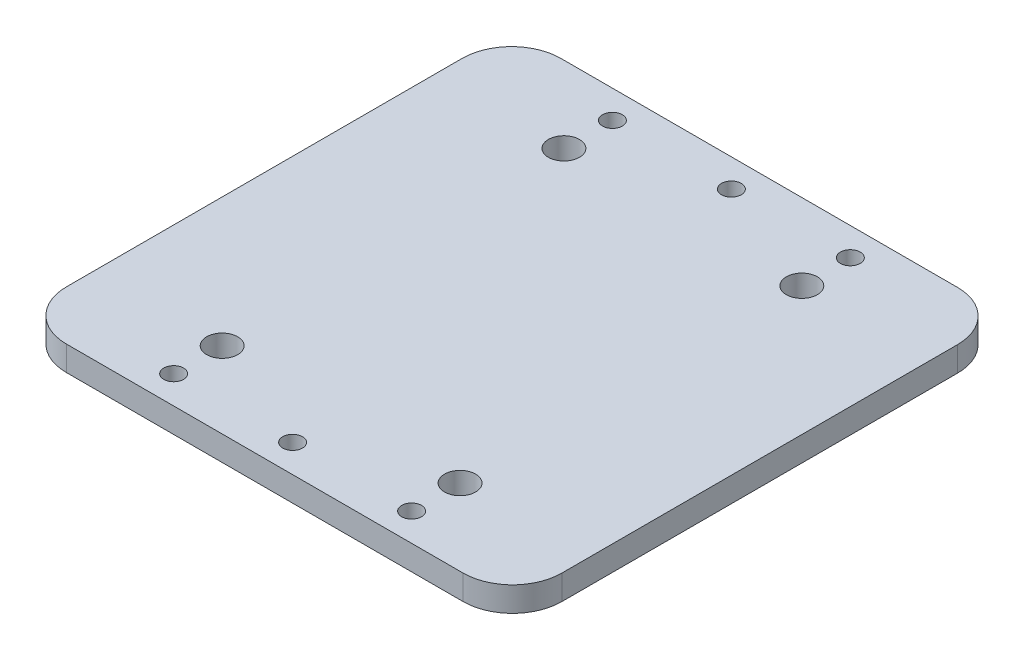
ISO-10303-21;
HEADER;
FILE_DESCRIPTION(('STEP AP214'),'2;1');
FILE_NAME('part.step','',(''),(''),'','','');
FILE_SCHEMA(('AUTOMOTIVE_DESIGN { 1 0 10303 214 1 1 1 1 }'));
ENDSEC;
DATA;
#1=APPLICATION_CONTEXT('core data for automotive mechanical design processes');
#2=APPLICATION_PROTOCOL_DEFINITION('international standard','automotive_design',2000,#1);
#3=PRODUCT_CONTEXT('',#1,'mechanical');
#4=PRODUCT('Part','Part','',(#3));
#5=PRODUCT_RELATED_PRODUCT_CATEGORY('part','',(#4));
#6=PRODUCT_DEFINITION_FORMATION('','',#4);
#7=PRODUCT_DEFINITION_CONTEXT('part definition',#1,'design');
#8=PRODUCT_DEFINITION('design','',#6,#7);
#9=PRODUCT_DEFINITION_SHAPE('','',#8);
#10=(LENGTH_UNIT() NAMED_UNIT(*) SI_UNIT(.MILLI.,.METRE.));
#11=(NAMED_UNIT(*) PLANE_ANGLE_UNIT() SI_UNIT($,.RADIAN.));
#12=(NAMED_UNIT(*) SI_UNIT($,.STERADIAN.) SOLID_ANGLE_UNIT());
#13=UNCERTAINTY_MEASURE_WITH_UNIT(LENGTH_MEASURE(1.E-05),#10,'distance_accuracy_value','');
#14=(GEOMETRIC_REPRESENTATION_CONTEXT(3) GLOBAL_UNCERTAINTY_ASSIGNED_CONTEXT((#13)) GLOBAL_UNIT_ASSIGNED_CONTEXT((#10,
#11,#12)) REPRESENTATION_CONTEXT('',''));
#15=CARTESIAN_POINT('',(0.,0.,0.));
#16=DIRECTION('',(0.,0.,1.));
#17=DIRECTION('',(1.,0.,0.));
#18=AXIS2_PLACEMENT_3D('',#15,#16,#17);
#19=CARTESIAN_POINT('',(0.,5.,0.));
#20=DIRECTION('',(0.,1.,0.));
#21=DIRECTION('',(0.,0.,1.));
#22=AXIS2_PLACEMENT_3D('',#19,#20,#21);
#23=PLANE('',#22);
#24=CARTESIAN_POINT('',(4.40209205020921,5.,23.594960522969));
#25=DIRECTION('',(0.,1.,0.));
#26=DIRECTION('',(0.,0.,-1.));
#27=AXIS2_PLACEMENT_3D('',#24,#25,#26);
#28=CIRCLE('',#27,2.);
#29=CARTESIAN_POINT('',(4.40209205020921,5.,21.594960522969));
#30=VERTEX_POINT('',#29);
#31=EDGE_CURVE('E272',#30,#30,#28,.T.);
#32=ORIENTED_EDGE('',*,*,#31,.F.);
#33=EDGE_LOOP('',(#32));
#34=FACE_BOUND('',#33,.T.);
#35=CARTESIAN_POINT('',(28.4520920502092,5.,-65.1100232844753));
#36=DIRECTION('',(0.,1.,0.));
#37=DIRECTION('',(0.,0.,1.));
#38=AXIS2_PLACEMENT_3D('',#35,#36,#37);
#39=CIRCLE('',#38,2.);
#40=CARTESIAN_POINT('',(28.4520920502092,5.,-63.1100232844753));
#41=VERTEX_POINT('',#40);
#42=EDGE_CURVE('E256',#41,#41,#39,.T.);
#43=ORIENTED_EDGE('',*,*,#42,.F.);
#44=EDGE_LOOP('',(#43));
#45=FACE_BOUND('',#44,.T.);
#46=CARTESIAN_POINT('',(-19.6479079497901,5.,13.7924686192469));
#47=DIRECTION('',(0.,1.,0.));
#48=DIRECTION('',(0.,0.,1.));
#49=AXIS2_PLACEMENT_3D('',#46,#47,#48);
#50=CIRCLE('',#49,3.14);
#51=CARTESIAN_POINT('',(-19.6479079497901,5.,16.9324686192469));
#52=VERTEX_POINT('',#51);
#53=EDGE_CURVE('E240',#52,#52,#50,.T.);
#54=ORIENTED_EDGE('',*,*,#53,.F.);
#55=EDGE_LOOP('',(#54));
#56=FACE_BOUND('',#55,.T.);
#57=CARTESIAN_POINT('',(28.4520920502092,5.,-55.3075313807531));
#58=DIRECTION('',(0.,1.,0.));
#59=DIRECTION('',(0.,0.,1.));
#60=AXIS2_PLACEMENT_3D('',#57,#58,#59);
#61=CIRCLE('',#60,3.14);
#62=CARTESIAN_POINT('',(28.4520920502092,5.,-52.1675313807531));
#63=VERTEX_POINT('',#62);
#64=EDGE_CURVE('E224',#63,#63,#61,.T.);
#65=ORIENTED_EDGE('',*,*,#64,.F.);
#66=EDGE_LOOP('',(#65));
#67=FACE_BOUND('',#66,.T.);
#68=CARTESIAN_POINT('',(-19.6479079497908,5.,-55.3075313807531));
#69=DIRECTION('',(0.,1.,0.));
#70=DIRECTION('',(0.,0.,1.));
#71=AXIS2_PLACEMENT_3D('',#68,#69,#70);
#72=CIRCLE('',#71,3.14);
#73=CARTESIAN_POINT('',(-19.6479079497908,5.,-52.1675313807531));
#74=VERTEX_POINT('',#73);
#75=EDGE_CURVE('E139',#74,#74,#72,.T.);
#76=ORIENTED_EDGE('',*,*,#75,.F.);
#77=EDGE_LOOP('',(#76));
#78=FACE_BOUND('',#77,.T.);
#79=DIRECTION('',(-1.,0.,0.));
#80=VECTOR('',#79,1.);
#81=CARTESIAN_POINT('',(-45.6979079497908,5.,-70.7575313807531));
#82=LINE('',#81,#80);
#83=CARTESIAN_POINT('',(44.5020920502092,5.,-70.7575313807531));
#84=VERTEX_POINT('',#83);
#85=CARTESIAN_POINT('',(-35.6979079497908,5.,-70.7575313807531));
#86=VERTEX_POINT('',#85);
#87=EDGE_CURVE('E150',#84,#86,#82,.T.);
#88=ORIENTED_EDGE('',*,*,#87,.T.);
#89=CARTESIAN_POINT('',(-35.6979079497908,5.,-60.7575313807531));
#90=DIRECTION('',(0.,1.,0.));
#91=DIRECTION('',(0.,0.,1.));
#92=AXIS2_PLACEMENT_3D('',#89,#90,#91);
#93=CIRCLE('',#92,10.);
#94=CARTESIAN_POINT('',(-45.6979079497908,5.,-60.7575313807531));
#95=VERTEX_POINT('',#94);
#96=EDGE_CURVE('E179',#86,#95,#93,.T.);
#97=ORIENTED_EDGE('',*,*,#96,.T.);
#98=DIRECTION('',(0.,0.,1.));
#99=VECTOR('',#98,1.);
#100=CARTESIAN_POINT('',(-45.6979079497908,5.,-70.7575313807531));
#101=LINE('',#100,#99);
#102=CARTESIAN_POINT('',(-45.6979079497908,5.,19.2424686192469));
#103=VERTEX_POINT('',#102);
#104=EDGE_CURVE('E128',#95,#103,#101,.T.);
#105=ORIENTED_EDGE('',*,*,#104,.T.);
#106=CARTESIAN_POINT('',(-35.6979079497908,5.,19.2424686192469));
#107=DIRECTION('',(0.,1.,0.));
#108=DIRECTION('',(0.,0.,1.));
#109=AXIS2_PLACEMENT_3D('',#106,#107,#108);
#110=CIRCLE('',#109,10.);
#111=CARTESIAN_POINT('',(-35.6979079497908,5.,29.2424686192469));
#112=VERTEX_POINT('',#111);
#113=EDGE_CURVE('E173',#103,#112,#110,.T.);
#114=ORIENTED_EDGE('',*,*,#113,.T.);
#115=DIRECTION('',(1.,0.,0.));
#116=VECTOR('',#115,1.);
#117=CARTESIAN_POINT('',(-45.6979079497908,5.,29.2424686192469));
#118=LINE('',#117,#116);
#119=CARTESIAN_POINT('',(44.5020920502092,5.,29.2424686192469));
#120=VERTEX_POINT('',#119);
#121=EDGE_CURVE('E192',#112,#120,#118,.T.);
#122=ORIENTED_EDGE('',*,*,#121,.T.);
#123=CARTESIAN_POINT('',(44.5020920502092,5.,19.2424686192469));
#124=DIRECTION('',(0.,1.,0.));
#125=DIRECTION('',(0.,0.,1.));
#126=AXIS2_PLACEMENT_3D('',#123,#124,#125);
#127=CIRCLE('',#126,10.);
#128=CARTESIAN_POINT('',(54.5020920502092,5.,19.2424686192469));
#129=VERTEX_POINT('',#128);
#130=EDGE_CURVE('E62',#120,#129,#127,.T.);
#131=ORIENTED_EDGE('',*,*,#130,.T.);
#132=DIRECTION('',(0.,0.,-1.));
#133=VECTOR('',#132,1.);
#134=CARTESIAN_POINT('',(54.5020920502092,5.,-70.7575313807531));
#135=LINE('',#134,#133);
#136=CARTESIAN_POINT('',(54.5020920502092,5.,-60.7575313807531));
#137=VERTEX_POINT('',#136);
#138=EDGE_CURVE('E199',#129,#137,#135,.T.);
#139=ORIENTED_EDGE('',*,*,#138,.T.);
#140=CARTESIAN_POINT('',(44.5020920502092,5.,-60.7575313807531));
#141=DIRECTION('',(0.,1.,0.));
#142=DIRECTION('',(0.,0.,1.));
#143=AXIS2_PLACEMENT_3D('',#140,#141,#142);
#144=CIRCLE('',#143,10.);
#145=EDGE_CURVE('E176',#137,#84,#144,.T.);
#146=ORIENTED_EDGE('',*,*,#145,.T.);
#147=EDGE_LOOP('',(#88,#97,#105,#114,#122,#131,#139,#146));
#148=FACE_BOUND('',#147,.T.);
#149=CARTESIAN_POINT('',(-19.6479079497908,5.,-65.1100232844753));
#150=DIRECTION('',(0.,1.,0.));
#151=DIRECTION('',(0.,0.,1.));
#152=AXIS2_PLACEMENT_3D('',#149,#150,#151);
#153=CIRCLE('',#152,2.);
#154=CARTESIAN_POINT('',(-19.6479079497908,5.,-63.1100232844753));
#155=VERTEX_POINT('',#154);
#156=EDGE_CURVE('E218',#155,#155,#153,.T.);
#157=ORIENTED_EDGE('',*,*,#156,.F.);
#158=EDGE_LOOP('',(#157));
#159=FACE_BOUND('',#158,.T.);
#160=CARTESIAN_POINT('',(28.4520920502099,5.,13.7924686192469));
#161=DIRECTION('',(0.,1.,0.));
#162=DIRECTION('',(0.,0.,1.));
#163=AXIS2_PLACEMENT_3D('',#160,#161,#162);
#164=CIRCLE('',#163,3.14);
#165=CARTESIAN_POINT('',(28.4520920502099,5.,16.9324686192469));
#166=VERTEX_POINT('',#165);
#167=EDGE_CURVE('E232',#166,#166,#164,.T.);
#168=ORIENTED_EDGE('',*,*,#167,.F.);
#169=EDGE_LOOP('',(#168));
#170=FACE_BOUND('',#169,.T.);
#171=CARTESIAN_POINT('',(4.40209205020921,5.,-65.1100232844753));
#172=DIRECTION('',(0.,1.,0.));
#173=DIRECTION('',(0.,0.,1.));
#174=AXIS2_PLACEMENT_3D('',#171,#172,#173);
#175=CIRCLE('',#174,2.);
#176=CARTESIAN_POINT('',(4.40209205020921,5.,-63.1100232844753));
#177=VERTEX_POINT('',#176);
#178=EDGE_CURVE('E248',#177,#177,#175,.T.);
#179=ORIENTED_EDGE('',*,*,#178,.F.);
#180=EDGE_LOOP('',(#179));
#181=FACE_BOUND('',#180,.T.);
#182=CARTESIAN_POINT('',(28.4520920502092,5.,23.594960522969));
#183=DIRECTION('',(0.,1.,0.));
#184=DIRECTION('',(0.,0.,-1.));
#185=AXIS2_PLACEMENT_3D('',#182,#183,#184);
#186=CIRCLE('',#185,2.);
#187=CARTESIAN_POINT('',(28.4520920502092,5.,21.594960522969));
#188=VERTEX_POINT('',#187);
#189=EDGE_CURVE('E264',#188,#188,#186,.T.);
#190=ORIENTED_EDGE('',*,*,#189,.F.);
#191=EDGE_LOOP('',(#190));
#192=FACE_BOUND('',#191,.T.);
#193=CARTESIAN_POINT('',(-19.6479079497908,5.,23.594960522969));
#194=DIRECTION('',(0.,1.,0.));
#195=DIRECTION('',(0.,0.,-1.));
#196=AXIS2_PLACEMENT_3D('',#193,#194,#195);
#197=CIRCLE('',#196,2.);
#198=CARTESIAN_POINT('',(-19.6479079497908,5.,21.594960522969));
#199=VERTEX_POINT('',#198);
#200=EDGE_CURVE('E280',#199,#199,#197,.T.);
#201=ORIENTED_EDGE('',*,*,#200,.F.);
#202=EDGE_LOOP('',(#201));
#203=FACE_BOUND('',#202,.T.);
#204=ADVANCED_FACE('F39',(#34,#45,#56,#67,#78,#148,#159,#170,#181,#192,#203),#23,.T.);
#205=CARTESIAN_POINT('',(0.,0.,0.));
#206=DIRECTION('',(0.,1.,0.));
#207=DIRECTION('',(0.,0.,1.));
#208=AXIS2_PLACEMENT_3D('',#205,#206,#207);
#209=PLANE('',#208);
#210=DIRECTION('',(0.,0.,1.));
#211=VECTOR('',#210,1.);
#212=CARTESIAN_POINT('',(-45.6979079497908,0.,-70.7575313807531));
#213=LINE('',#212,#211);
#214=CARTESIAN_POINT('',(-45.6979079497908,0.,-60.7575313807531));
#215=VERTEX_POINT('',#214);
#216=CARTESIAN_POINT('',(-45.6979079497908,0.,19.2424686192469));
#217=VERTEX_POINT('',#216);
#218=EDGE_CURVE('E125',#215,#217,#213,.T.);
#219=ORIENTED_EDGE('',*,*,#218,.F.);
#220=CARTESIAN_POINT('',(-35.6979079497908,0.,-60.7575313807531));
#221=DIRECTION('',(0.,1.,0.));
#222=DIRECTION('',(0.,0.,1.));
#223=AXIS2_PLACEMENT_3D('',#220,#221,#222);
#224=CIRCLE('',#223,10.);
#225=CARTESIAN_POINT('',(-35.6979079497908,0.,-70.7575313807531));
#226=VERTEX_POINT('',#225);
#227=EDGE_CURVE('E107',#215,#226,#224,.F.);
#228=ORIENTED_EDGE('',*,*,#227,.T.);
#229=DIRECTION('',(-1.,0.,0.));
#230=VECTOR('',#229,1.);
#231=CARTESIAN_POINT('',(-45.6979079497908,0.,-70.7575313807531));
#232=LINE('',#231,#230);
#233=CARTESIAN_POINT('',(44.5020920502092,0.,-70.7575313807531));
#234=VERTEX_POINT('',#233);
#235=EDGE_CURVE('E155',#234,#226,#232,.T.);
#236=ORIENTED_EDGE('',*,*,#235,.F.);
#237=CARTESIAN_POINT('',(44.5020920502092,0.,-60.7575313807531));
#238=DIRECTION('',(0.,1.,0.));
#239=DIRECTION('',(0.,0.,1.));
#240=AXIS2_PLACEMENT_3D('',#237,#238,#239);
#241=CIRCLE('',#240,10.);
#242=CARTESIAN_POINT('',(54.5020920502092,0.,-60.7575313807531));
#243=VERTEX_POINT('',#242);
#244=EDGE_CURVE('E119',#234,#243,#241,.F.);
#245=ORIENTED_EDGE('',*,*,#244,.T.);
#246=DIRECTION('',(0.,0.,-1.));
#247=VECTOR('',#246,1.);
#248=CARTESIAN_POINT('',(54.5020920502092,0.,-70.7575313807531));
#249=LINE('',#248,#247);
#250=CARTESIAN_POINT('',(54.5020920502092,0.,19.2424686192469));
#251=VERTEX_POINT('',#250);
#252=EDGE_CURVE('E144',#251,#243,#249,.T.);
#253=ORIENTED_EDGE('',*,*,#252,.F.);
#254=CARTESIAN_POINT('',(44.5020920502092,0.,19.2424686192469));
#255=DIRECTION('',(0.,1.,0.));
#256=DIRECTION('',(0.,0.,1.));
#257=AXIS2_PLACEMENT_3D('',#254,#255,#256);
#258=CIRCLE('',#257,10.);
#259=CARTESIAN_POINT('',(44.5020920502092,0.,29.2424686192469));
#260=VERTEX_POINT('',#259);
#261=EDGE_CURVE('E130',#251,#260,#258,.F.);
#262=ORIENTED_EDGE('',*,*,#261,.T.);
#263=DIRECTION('',(1.,0.,0.));
#264=VECTOR('',#263,1.);
#265=CARTESIAN_POINT('',(-45.6979079497908,0.,29.2424686192469));
#266=LINE('',#265,#264);
#267=CARTESIAN_POINT('',(-35.6979079497908,0.,29.2424686192469));
#268=VERTEX_POINT('',#267);
#269=EDGE_CURVE('E138',#268,#260,#266,.T.);
#270=ORIENTED_EDGE('',*,*,#269,.F.);
#271=CARTESIAN_POINT('',(-35.6979079497908,0.,19.2424686192469));
#272=DIRECTION('',(0.,1.,0.));
#273=DIRECTION('',(0.,0.,1.));
#274=AXIS2_PLACEMENT_3D('',#271,#272,#273);
#275=CIRCLE('',#274,10.);
#276=EDGE_CURVE('E136',#268,#217,#275,.F.);
#277=ORIENTED_EDGE('',*,*,#276,.T.);
#278=EDGE_LOOP('',(#219,#228,#236,#245,#253,#262,#270,#277));
#279=FACE_BOUND('',#278,.T.);
#280=CARTESIAN_POINT('',(-19.6479079497908,0.,-55.3075313807531));
#281=DIRECTION('',(0.,1.,0.));
#282=DIRECTION('',(0.,0.,1.));
#283=AXIS2_PLACEMENT_3D('',#280,#281,#282);
#284=CIRCLE('',#283,3.14);
#285=CARTESIAN_POINT('',(-19.6479079497908,0.,-52.1675313807531));
#286=VERTEX_POINT('',#285);
#287=EDGE_CURVE('E147',#286,#286,#284,.T.);
#288=ORIENTED_EDGE('',*,*,#287,.T.);
#289=EDGE_LOOP('',(#288));
#290=FACE_BOUND('',#289,.T.);
#291=CARTESIAN_POINT('',(-19.6479079497908,0.,-65.1100232844753));
#292=DIRECTION('',(0.,1.,0.));
#293=DIRECTION('',(0.,0.,1.));
#294=AXIS2_PLACEMENT_3D('',#291,#292,#293);
#295=CIRCLE('',#294,2.);
#296=CARTESIAN_POINT('',(-19.6479079497908,0.,-63.1100232844753));
#297=VERTEX_POINT('',#296);
#298=EDGE_CURVE('E220',#297,#297,#295,.T.);
#299=ORIENTED_EDGE('',*,*,#298,.T.);
#300=EDGE_LOOP('',(#299));
#301=FACE_BOUND('',#300,.T.);
#302=CARTESIAN_POINT('',(28.4520920502092,0.,-55.3075313807531));
#303=DIRECTION('',(0.,1.,0.));
#304=DIRECTION('',(0.,0.,1.));
#305=AXIS2_PLACEMENT_3D('',#302,#303,#304);
#306=CIRCLE('',#305,3.14);
#307=CARTESIAN_POINT('',(28.4520920502092,0.,-52.1675313807531));
#308=VERTEX_POINT('',#307);
#309=EDGE_CURVE('E228',#308,#308,#306,.T.);
#310=ORIENTED_EDGE('',*,*,#309,.T.);
#311=EDGE_LOOP('',(#310));
#312=FACE_BOUND('',#311,.T.);
#313=CARTESIAN_POINT('',(28.4520920502099,0.,13.7924686192469));
#314=DIRECTION('',(0.,1.,0.));
#315=DIRECTION('',(0.,0.,1.));
#316=AXIS2_PLACEMENT_3D('',#313,#314,#315);
#317=CIRCLE('',#316,3.14);
#318=CARTESIAN_POINT('',(28.4520920502099,0.,16.9324686192469));
#319=VERTEX_POINT('',#318);
#320=EDGE_CURVE('E236',#319,#319,#317,.T.);
#321=ORIENTED_EDGE('',*,*,#320,.T.);
#322=EDGE_LOOP('',(#321));
#323=FACE_BOUND('',#322,.T.);
#324=CARTESIAN_POINT('',(-19.6479079497901,0.,13.7924686192469));
#325=DIRECTION('',(0.,1.,0.));
#326=DIRECTION('',(0.,0.,1.));
#327=AXIS2_PLACEMENT_3D('',#324,#325,#326);
#328=CIRCLE('',#327,3.14);
#329=CARTESIAN_POINT('',(-19.6479079497901,0.,16.9324686192469));
#330=VERTEX_POINT('',#329);
#331=EDGE_CURVE('E244',#330,#330,#328,.T.);
#332=ORIENTED_EDGE('',*,*,#331,.T.);
#333=EDGE_LOOP('',(#332));
#334=FACE_BOUND('',#333,.T.);
#335=CARTESIAN_POINT('',(4.40209205020921,0.,-65.1100232844753));
#336=DIRECTION('',(0.,1.,0.));
#337=DIRECTION('',(0.,0.,1.));
#338=AXIS2_PLACEMENT_3D('',#335,#336,#337);
#339=CIRCLE('',#338,2.);
#340=CARTESIAN_POINT('',(4.40209205020921,0.,-63.1100232844753));
#341=VERTEX_POINT('',#340);
#342=EDGE_CURVE('E252',#341,#341,#339,.T.);
#343=ORIENTED_EDGE('',*,*,#342,.T.);
#344=EDGE_LOOP('',(#343));
#345=FACE_BOUND('',#344,.T.);
#346=CARTESIAN_POINT('',(28.4520920502092,0.,-65.1100232844753));
#347=DIRECTION('',(0.,1.,0.));
#348=DIRECTION('',(0.,0.,1.));
#349=AXIS2_PLACEMENT_3D('',#346,#347,#348);
#350=CIRCLE('',#349,2.);
#351=CARTESIAN_POINT('',(28.4520920502092,0.,-63.1100232844753));
#352=VERTEX_POINT('',#351);
#353=EDGE_CURVE('E260',#352,#352,#350,.T.);
#354=ORIENTED_EDGE('',*,*,#353,.T.);
#355=EDGE_LOOP('',(#354));
#356=FACE_BOUND('',#355,.T.);
#357=CARTESIAN_POINT('',(28.4520920502092,0.,23.594960522969));
#358=DIRECTION('',(0.,1.,0.));
#359=DIRECTION('',(0.,0.,-1.));
#360=AXIS2_PLACEMENT_3D('',#357,#358,#359);
#361=CIRCLE('',#360,2.);
#362=CARTESIAN_POINT('',(28.4520920502092,0.,21.594960522969));
#363=VERTEX_POINT('',#362);
#364=EDGE_CURVE('E268',#363,#363,#361,.T.);
#365=ORIENTED_EDGE('',*,*,#364,.T.);
#366=EDGE_LOOP('',(#365));
#367=FACE_BOUND('',#366,.T.);
#368=CARTESIAN_POINT('',(4.40209205020921,0.,23.594960522969));
#369=DIRECTION('',(0.,1.,0.));
#370=DIRECTION('',(0.,0.,-1.));
#371=AXIS2_PLACEMENT_3D('',#368,#369,#370);
#372=CIRCLE('',#371,2.);
#373=CARTESIAN_POINT('',(4.40209205020921,0.,21.594960522969));
#374=VERTEX_POINT('',#373);
#375=EDGE_CURVE('E276',#374,#374,#372,.T.);
#376=ORIENTED_EDGE('',*,*,#375,.T.);
#377=EDGE_LOOP('',(#376));
#378=FACE_BOUND('',#377,.T.);
#379=CARTESIAN_POINT('',(-19.6479079497908,0.,23.594960522969));
#380=DIRECTION('',(0.,1.,0.));
#381=DIRECTION('',(0.,0.,-1.));
#382=AXIS2_PLACEMENT_3D('',#379,#380,#381);
#383=CIRCLE('',#382,2.);
#384=CARTESIAN_POINT('',(-19.6479079497908,0.,21.594960522969));
#385=VERTEX_POINT('',#384);
#386=EDGE_CURVE('E284',#385,#385,#383,.T.);
#387=ORIENTED_EDGE('',*,*,#386,.T.);
#388=EDGE_LOOP('',(#387));
#389=FACE_BOUND('',#388,.T.);
#390=ADVANCED_FACE('F133',(#279,#290,#301,#312,#323,#334,#345,#356,#367,#378,#389),#209,.F.);
#391=CARTESIAN_POINT('',(-45.6979079497908,5.,-70.7575313807531));
#392=DIRECTION('',(1.,0.,0.));
#393=DIRECTION('',(0.,0.,-1.));
#394=AXIS2_PLACEMENT_3D('',#391,#392,#393);
#395=PLANE('',#394);
#396=ORIENTED_EDGE('',*,*,#104,.F.);
#397=DIRECTION('',(0.,-1.,0.));
#398=VECTOR('',#397,1.);
#399=CARTESIAN_POINT('',(-45.6979079497908,5.,-60.7575313807531));
#400=LINE('',#399,#398);
#401=EDGE_CURVE('E111',#95,#215,#400,.T.);
#402=ORIENTED_EDGE('',*,*,#401,.T.);
#403=ORIENTED_EDGE('',*,*,#218,.T.);
#404=DIRECTION('',(0.,-1.,0.));
#405=VECTOR('',#404,1.);
#406=CARTESIAN_POINT('',(-45.6979079497908,5.,19.2424686192469));
#407=LINE('',#406,#405);
#408=EDGE_CURVE('E131',#217,#103,#407,.F.);
#409=ORIENTED_EDGE('',*,*,#408,.T.);
#410=EDGE_LOOP('',(#396,#402,#403,#409));
#411=FACE_BOUND('',#410,.T.);
#412=ADVANCED_FACE('F124',(#411),#395,.F.);
#413=CARTESIAN_POINT('',(-45.6979079497908,5.,29.2424686192469));
#414=DIRECTION('',(0.,0.,-1.));
#415=DIRECTION('',(-1.,0.,0.));
#416=AXIS2_PLACEMENT_3D('',#413,#414,#415);
#417=PLANE('',#416);
#418=ORIENTED_EDGE('',*,*,#121,.F.);
#419=DIRECTION('',(0.,-1.,0.));
#420=VECTOR('',#419,1.);
#421=CARTESIAN_POINT('',(-35.6979079497908,5.,29.2424686192469));
#422=LINE('',#421,#420);
#423=EDGE_CURVE('E11',#112,#268,#422,.T.);
#424=ORIENTED_EDGE('',*,*,#423,.T.);
#425=ORIENTED_EDGE('',*,*,#269,.T.);
#426=DIRECTION('',(0.,-1.,0.));
#427=VECTOR('',#426,1.);
#428=CARTESIAN_POINT('',(44.5020920502092,5.,29.2424686192469));
#429=LINE('',#428,#427);
#430=EDGE_CURVE('E48',#260,#120,#429,.F.);
#431=ORIENTED_EDGE('',*,*,#430,.T.);
#432=EDGE_LOOP('',(#418,#424,#425,#431));
#433=FACE_BOUND('',#432,.T.);
#434=ADVANCED_FACE('F191',(#433),#417,.F.);
#435=CARTESIAN_POINT('',(54.5020920502092,5.,-70.7575313807531));
#436=DIRECTION('',(-1.,0.,0.));
#437=DIRECTION('',(0.,0.,1.));
#438=AXIS2_PLACEMENT_3D('',#435,#436,#437);
#439=PLANE('',#438);
#440=ORIENTED_EDGE('',*,*,#252,.T.);
#441=DIRECTION('',(0.,-1.,0.));
#442=VECTOR('',#441,1.);
#443=CARTESIAN_POINT('',(54.5020920502092,5.,-60.7575313807531));
#444=LINE('',#443,#442);
#445=EDGE_CURVE('E55',#243,#137,#444,.F.);
#446=ORIENTED_EDGE('',*,*,#445,.T.);
#447=ORIENTED_EDGE('',*,*,#138,.F.);
#448=DIRECTION('',(0.,-1.,0.));
#449=VECTOR('',#448,1.);
#450=CARTESIAN_POINT('',(54.5020920502092,5.,19.2424686192469));
#451=LINE('',#450,#449);
#452=EDGE_CURVE('E182',#129,#251,#451,.T.);
#453=ORIENTED_EDGE('',*,*,#452,.T.);
#454=EDGE_LOOP('',(#440,#446,#447,#453));
#455=FACE_BOUND('',#454,.T.);
#456=ADVANCED_FACE('F203',(#455),#439,.F.);
#457=CARTESIAN_POINT('',(-45.6979079497908,5.,-70.7575313807531));
#458=DIRECTION('',(0.,0.,1.));
#459=DIRECTION('',(1.,0.,0.));
#460=AXIS2_PLACEMENT_3D('',#457,#458,#459);
#461=PLANE('',#460);
#462=ORIENTED_EDGE('',*,*,#235,.T.);
#463=DIRECTION('',(0.,-1.,0.));
#464=VECTOR('',#463,1.);
#465=CARTESIAN_POINT('',(-35.6979079497908,5.,-70.7575313807531));
#466=LINE('',#465,#464);
#467=EDGE_CURVE('E112',#226,#86,#466,.F.);
#468=ORIENTED_EDGE('',*,*,#467,.T.);
#469=ORIENTED_EDGE('',*,*,#87,.F.);
#470=DIRECTION('',(0.,-1.,0.));
#471=VECTOR('',#470,1.);
#472=CARTESIAN_POINT('',(44.5020920502092,5.,-70.7575313807531));
#473=LINE('',#472,#471);
#474=EDGE_CURVE('E118',#84,#234,#473,.T.);
#475=ORIENTED_EDGE('',*,*,#474,.T.);
#476=EDGE_LOOP('',(#462,#468,#469,#475));
#477=FACE_BOUND('',#476,.T.);
#478=ADVANCED_FACE('F210',(#477),#461,.F.);
#479=CARTESIAN_POINT('',(-19.6479079497908,5.,-55.3075313807531));
#480=DIRECTION('',(0.,-1.,0.));
#481=DIRECTION('',(0.,0.,-1.));
#482=AXIS2_PLACEMENT_3D('',#479,#480,#481);
#483=CYLINDRICAL_SURFACE('',#482,3.14);
#484=ORIENTED_EDGE('',*,*,#75,.T.);
#485=EDGE_LOOP('',(#484));
#486=FACE_BOUND('',#485,.T.);
#487=ORIENTED_EDGE('',*,*,#287,.F.);
#488=EDGE_LOOP('',(#487));
#489=FACE_BOUND('',#488,.T.);
#490=ADVANCED_FACE('F305',(#486,#489),#483,.F.);
#491=CARTESIAN_POINT('',(-19.6479079497908,5.,-65.1100232844753));
#492=DIRECTION('',(0.,-1.,0.));
#493=DIRECTION('',(0.,0.,-1.));
#494=AXIS2_PLACEMENT_3D('',#491,#492,#493);
#495=CYLINDRICAL_SURFACE('',#494,2.);
#496=ORIENTED_EDGE('',*,*,#156,.T.);
#497=EDGE_LOOP('',(#496));
#498=FACE_BOUND('',#497,.T.);
#499=ORIENTED_EDGE('',*,*,#298,.F.);
#500=EDGE_LOOP('',(#499));
#501=FACE_BOUND('',#500,.T.);
#502=ADVANCED_FACE('F457',(#498,#501),#495,.F.);
#503=CARTESIAN_POINT('',(28.4520920502092,5.,-55.3075313807531));
#504=DIRECTION('',(0.,-1.,0.));
#505=DIRECTION('',(0.,0.,-1.));
#506=AXIS2_PLACEMENT_3D('',#503,#504,#505);
#507=CYLINDRICAL_SURFACE('',#506,3.14);
#508=ORIENTED_EDGE('',*,*,#64,.T.);
#509=EDGE_LOOP('',(#508));
#510=FACE_BOUND('',#509,.T.);
#511=ORIENTED_EDGE('',*,*,#309,.F.);
#512=EDGE_LOOP('',(#511));
#513=FACE_BOUND('',#512,.T.);
#514=ADVANCED_FACE('F447',(#510,#513),#507,.F.);
#515=CARTESIAN_POINT('',(28.4520920502099,5.,13.7924686192469));
#516=DIRECTION('',(0.,-1.,0.));
#517=DIRECTION('',(0.,0.,-1.));
#518=AXIS2_PLACEMENT_3D('',#515,#516,#517);
#519=CYLINDRICAL_SURFACE('',#518,3.14);
#520=ORIENTED_EDGE('',*,*,#167,.T.);
#521=EDGE_LOOP('',(#520));
#522=FACE_BOUND('',#521,.T.);
#523=ORIENTED_EDGE('',*,*,#320,.F.);
#524=EDGE_LOOP('',(#523));
#525=FACE_BOUND('',#524,.T.);
#526=ADVANCED_FACE('F437',(#522,#525),#519,.F.);
#527=CARTESIAN_POINT('',(-19.6479079497901,5.,13.7924686192469));
#528=DIRECTION('',(0.,-1.,0.));
#529=DIRECTION('',(0.,0.,-1.));
#530=AXIS2_PLACEMENT_3D('',#527,#528,#529);
#531=CYLINDRICAL_SURFACE('',#530,3.14);
#532=ORIENTED_EDGE('',*,*,#53,.T.);
#533=EDGE_LOOP('',(#532));
#534=FACE_BOUND('',#533,.T.);
#535=ORIENTED_EDGE('',*,*,#331,.F.);
#536=EDGE_LOOP('',(#535));
#537=FACE_BOUND('',#536,.T.);
#538=ADVANCED_FACE('F427',(#534,#537),#531,.F.);
#539=CARTESIAN_POINT('',(4.40209205020921,5.,-65.1100232844753));
#540=DIRECTION('',(0.,-1.,0.));
#541=DIRECTION('',(0.,0.,-1.));
#542=AXIS2_PLACEMENT_3D('',#539,#540,#541);
#543=CYLINDRICAL_SURFACE('',#542,2.);
#544=ORIENTED_EDGE('',*,*,#178,.T.);
#545=EDGE_LOOP('',(#544));
#546=FACE_BOUND('',#545,.T.);
#547=ORIENTED_EDGE('',*,*,#342,.F.);
#548=EDGE_LOOP('',(#547));
#549=FACE_BOUND('',#548,.T.);
#550=ADVANCED_FACE('F417',(#546,#549),#543,.F.);
#551=CARTESIAN_POINT('',(28.4520920502092,5.,-65.1100232844753));
#552=DIRECTION('',(0.,-1.,0.));
#553=DIRECTION('',(0.,0.,-1.));
#554=AXIS2_PLACEMENT_3D('',#551,#552,#553);
#555=CYLINDRICAL_SURFACE('',#554,2.);
#556=ORIENTED_EDGE('',*,*,#42,.T.);
#557=EDGE_LOOP('',(#556));
#558=FACE_BOUND('',#557,.T.);
#559=ORIENTED_EDGE('',*,*,#353,.F.);
#560=EDGE_LOOP('',(#559));
#561=FACE_BOUND('',#560,.T.);
#562=ADVANCED_FACE('F407',(#558,#561),#555,.F.);
#563=CARTESIAN_POINT('',(28.4520920502092,5.,23.594960522969));
#564=DIRECTION('',(0.,-1.,0.));
#565=DIRECTION('',(0.,0.,-1.));
#566=AXIS2_PLACEMENT_3D('',#563,#564,#565);
#567=CYLINDRICAL_SURFACE('',#566,2.);
#568=ORIENTED_EDGE('',*,*,#189,.T.);
#569=EDGE_LOOP('',(#568));
#570=FACE_BOUND('',#569,.T.);
#571=ORIENTED_EDGE('',*,*,#364,.F.);
#572=EDGE_LOOP('',(#571));
#573=FACE_BOUND('',#572,.T.);
#574=ADVANCED_FACE('F397',(#570,#573),#567,.F.);
#575=CARTESIAN_POINT('',(4.40209205020921,5.,23.594960522969));
#576=DIRECTION('',(0.,-1.,0.));
#577=DIRECTION('',(0.,0.,-1.));
#578=AXIS2_PLACEMENT_3D('',#575,#576,#577);
#579=CYLINDRICAL_SURFACE('',#578,2.);
#580=ORIENTED_EDGE('',*,*,#31,.T.);
#581=EDGE_LOOP('',(#580));
#582=FACE_BOUND('',#581,.T.);
#583=ORIENTED_EDGE('',*,*,#375,.F.);
#584=EDGE_LOOP('',(#583));
#585=FACE_BOUND('',#584,.T.);
#586=ADVANCED_FACE('F388',(#582,#585),#579,.F.);
#587=CARTESIAN_POINT('',(-19.6479079497908,5.,23.594960522969));
#588=DIRECTION('',(0.,-1.,0.));
#589=DIRECTION('',(0.,0.,-1.));
#590=AXIS2_PLACEMENT_3D('',#587,#588,#589);
#591=CYLINDRICAL_SURFACE('',#590,2.);
#592=ORIENTED_EDGE('',*,*,#200,.T.);
#593=EDGE_LOOP('',(#592));
#594=FACE_BOUND('',#593,.T.);
#595=ORIENTED_EDGE('',*,*,#386,.F.);
#596=EDGE_LOOP('',(#595));
#597=FACE_BOUND('',#596,.T.);
#598=ADVANCED_FACE('F292',(#594,#597),#591,.F.);
#599=CARTESIAN_POINT('',(-35.6979079497908,5.,-60.7575313807531));
#600=DIRECTION('',(0.,-1.,0.));
#601=DIRECTION('',(0.,0.,-1.));
#602=AXIS2_PLACEMENT_3D('',#599,#600,#601);
#603=CYLINDRICAL_SURFACE('',#602,10.);
#604=ORIENTED_EDGE('',*,*,#96,.F.);
#605=ORIENTED_EDGE('',*,*,#467,.F.);
#606=ORIENTED_EDGE('',*,*,#227,.F.);
#607=ORIENTED_EDGE('',*,*,#401,.F.);
#608=EDGE_LOOP('',(#604,#605,#606,#607));
#609=FACE_BOUND('',#608,.T.);
#610=ADVANCED_FACE('F110',(#609),#603,.T.);
#611=CARTESIAN_POINT('',(44.5020920502092,5.,-60.7575313807531));
#612=DIRECTION('',(0.,-1.,0.));
#613=DIRECTION('',(0.,0.,-1.));
#614=AXIS2_PLACEMENT_3D('',#611,#612,#613);
#615=CYLINDRICAL_SURFACE('',#614,10.);
#616=ORIENTED_EDGE('',*,*,#145,.F.);
#617=ORIENTED_EDGE('',*,*,#445,.F.);
#618=ORIENTED_EDGE('',*,*,#244,.F.);
#619=ORIENTED_EDGE('',*,*,#474,.F.);
#620=EDGE_LOOP('',(#616,#617,#618,#619));
#621=FACE_BOUND('',#620,.T.);
#622=ADVANCED_FACE('F207',(#621),#615,.T.);
#623=CARTESIAN_POINT('',(-35.6979079497908,5.,19.2424686192469));
#624=DIRECTION('',(0.,-1.,0.));
#625=DIRECTION('',(0.,0.,-1.));
#626=AXIS2_PLACEMENT_3D('',#623,#624,#625);
#627=CYLINDRICAL_SURFACE('',#626,10.);
#628=ORIENTED_EDGE('',*,*,#113,.F.);
#629=ORIENTED_EDGE('',*,*,#408,.F.);
#630=ORIENTED_EDGE('',*,*,#276,.F.);
#631=ORIENTED_EDGE('',*,*,#423,.F.);
#632=EDGE_LOOP('',(#628,#629,#630,#631));
#633=FACE_BOUND('',#632,.T.);
#634=ADVANCED_FACE('F319',(#633),#627,.T.);
#635=CARTESIAN_POINT('',(44.5020920502092,5.,19.2424686192469));
#636=DIRECTION('',(0.,-1.,0.));
#637=DIRECTION('',(0.,0.,-1.));
#638=AXIS2_PLACEMENT_3D('',#635,#636,#637);
#639=CYLINDRICAL_SURFACE('',#638,10.);
#640=ORIENTED_EDGE('',*,*,#130,.F.);
#641=ORIENTED_EDGE('',*,*,#430,.F.);
#642=ORIENTED_EDGE('',*,*,#261,.F.);
#643=ORIENTED_EDGE('',*,*,#452,.F.);
#644=EDGE_LOOP('',(#640,#641,#642,#643));
#645=FACE_BOUND('',#644,.T.);
#646=ADVANCED_FACE('F41',(#645),#639,.T.);
#647=CLOSED_SHELL('',(#204,#390,#412,#434,#456,#478,#490,#502,#514,#526,#538,#550,#562,#574,
#586,#598,#610,#622,#634,#646));
#648=MANIFOLD_SOLID_BREP('B2',#647);
#649=ADVANCED_BREP_SHAPE_REPRESENTATION('',(#18,#648),#14);
#650=SHAPE_DEFINITION_REPRESENTATION(#9,#649);
ENDSEC;
END-ISO-10303-21;
